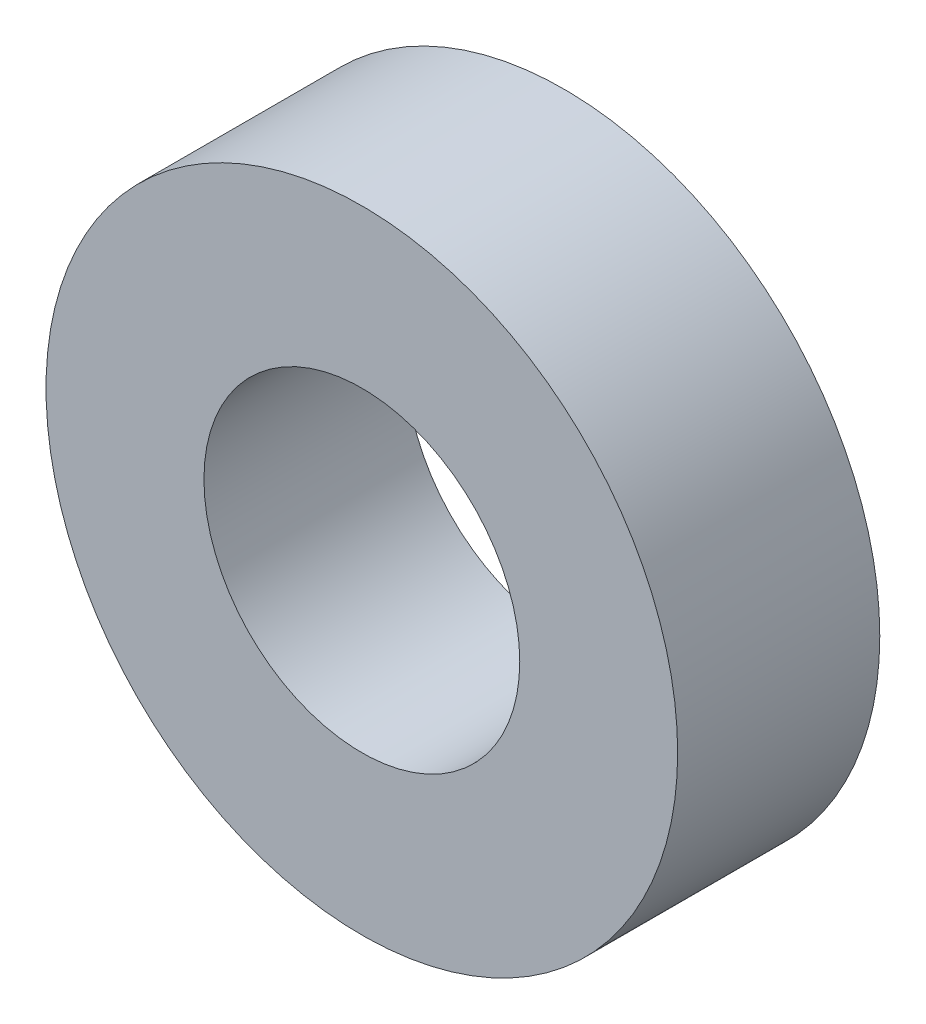
ISO-10303-21;
HEADER;
FILE_DESCRIPTION(('STEP AP214'),'2;1');
FILE_NAME('part.step','',(''),(''),'','','');
FILE_SCHEMA(('AUTOMOTIVE_DESIGN { 1 0 10303 214 1 1 1 1 }'));
ENDSEC;
DATA;
#1=APPLICATION_CONTEXT('core data for automotive mechanical design processes');
#2=APPLICATION_PROTOCOL_DEFINITION('international standard','automotive_design',2000,#1);
#3=PRODUCT_CONTEXT('',#1,'mechanical');
#4=PRODUCT('Part','Part','',(#3));
#5=PRODUCT_RELATED_PRODUCT_CATEGORY('part','',(#4));
#6=PRODUCT_DEFINITION_FORMATION('','',#4);
#7=PRODUCT_DEFINITION_CONTEXT('part definition',#1,'design');
#8=PRODUCT_DEFINITION('design','',#6,#7);
#9=PRODUCT_DEFINITION_SHAPE('','',#8);
#10=(LENGTH_UNIT() NAMED_UNIT(*) SI_UNIT(.MILLI.,.METRE.));
#11=(NAMED_UNIT(*) PLANE_ANGLE_UNIT() SI_UNIT($,.RADIAN.));
#12=(NAMED_UNIT(*) SI_UNIT($,.STERADIAN.) SOLID_ANGLE_UNIT());
#13=UNCERTAINTY_MEASURE_WITH_UNIT(LENGTH_MEASURE(1.E-05),#10,'distance_accuracy_value','');
#14=(GEOMETRIC_REPRESENTATION_CONTEXT(3) GLOBAL_UNCERTAINTY_ASSIGNED_CONTEXT((#13)) GLOBAL_UNIT_ASSIGNED_CONTEXT((#10,
#11,#12)) REPRESENTATION_CONTEXT('',''));
#15=CARTESIAN_POINT('',(0.,0.,0.));
#16=DIRECTION('',(0.,0.,1.));
#17=DIRECTION('',(1.,0.,0.));
#18=AXIS2_PLACEMENT_3D('',#15,#16,#17);
#19=CARTESIAN_POINT('',(0.,0.,16.));
#20=DIRECTION('',(0.,0.,1.));
#21=DIRECTION('',(1.,0.,0.));
#22=AXIS2_PLACEMENT_3D('',#19,#20,#21);
#23=PLANE('',#22);
#24=CARTESIAN_POINT('',(0.,0.,16.));
#25=DIRECTION('',(0.,0.,1.));
#26=DIRECTION('',(1.,0.,0.));
#27=AXIS2_PLACEMENT_3D('',#24,#25,#26);
#28=CIRCLE('',#27,25.);
#29=CARTESIAN_POINT('',(25.,0.,16.));
#30=VERTEX_POINT('',#29);
#31=EDGE_CURVE('E10',#30,#30,#28,.T.);
#32=ORIENTED_EDGE('',*,*,#31,.T.);
#33=EDGE_LOOP('',(#32));
#34=FACE_BOUND('',#33,.T.);
#35=CARTESIAN_POINT('',(0.,0.,16.));
#36=DIRECTION('',(0.,0.,1.));
#37=DIRECTION('',(1.,0.,0.));
#38=AXIS2_PLACEMENT_3D('',#35,#36,#37);
#39=CIRCLE('',#38,12.5);
#40=CARTESIAN_POINT('',(12.5,0.,16.));
#41=VERTEX_POINT('',#40);
#42=EDGE_CURVE('E50',#41,#41,#39,.T.);
#43=ORIENTED_EDGE('',*,*,#42,.F.);
#44=EDGE_LOOP('',(#43));
#45=FACE_BOUND('',#44,.T.);
#46=ADVANCED_FACE('F39',(#34,#45),#23,.T.);
#47=CARTESIAN_POINT('',(0.,0.,0.));
#48=DIRECTION('',(0.,0.,1.));
#49=DIRECTION('',(1.,0.,0.));
#50=AXIS2_PLACEMENT_3D('',#47,#48,#49);
#51=PLANE('',#50);
#52=CARTESIAN_POINT('',(0.,0.,0.));
#53=DIRECTION('',(0.,0.,1.));
#54=DIRECTION('',(1.,0.,0.));
#55=AXIS2_PLACEMENT_3D('',#52,#53,#54);
#56=CIRCLE('',#55,25.);
#57=CARTESIAN_POINT('',(25.,0.,0.));
#58=VERTEX_POINT('',#57);
#59=EDGE_CURVE('E43',#58,#58,#56,.T.);
#60=ORIENTED_EDGE('',*,*,#59,.F.);
#61=EDGE_LOOP('',(#60));
#62=FACE_BOUND('',#61,.T.);
#63=CARTESIAN_POINT('',(0.,0.,0.));
#64=DIRECTION('',(0.,0.,1.));
#65=DIRECTION('',(1.,0.,0.));
#66=AXIS2_PLACEMENT_3D('',#63,#64,#65);
#67=CIRCLE('',#66,12.5);
#68=CARTESIAN_POINT('',(12.5,0.,0.));
#69=VERTEX_POINT('',#68);
#70=EDGE_CURVE('E52',#69,#69,#67,.T.);
#71=ORIENTED_EDGE('',*,*,#70,.T.);
#72=EDGE_LOOP('',(#71));
#73=FACE_BOUND('',#72,.T.);
#74=ADVANCED_FACE('F62',(#62,#73),#51,.F.);
#75=CARTESIAN_POINT('',(0.,0.,16.));
#76=DIRECTION('',(0.,0.,-1.));
#77=DIRECTION('',(-1.,0.,0.));
#78=AXIS2_PLACEMENT_3D('',#75,#76,#77);
#79=CYLINDRICAL_SURFACE('',#78,25.);
#80=ORIENTED_EDGE('',*,*,#31,.F.);
#81=EDGE_LOOP('',(#80));
#82=FACE_BOUND('',#81,.T.);
#83=ORIENTED_EDGE('',*,*,#59,.T.);
#84=EDGE_LOOP('',(#83));
#85=FACE_BOUND('',#84,.T.);
#86=ADVANCED_FACE('F41',(#82,#85),#79,.T.);
#87=CARTESIAN_POINT('',(0.,0.,16.));
#88=DIRECTION('',(0.,0.,-1.));
#89=DIRECTION('',(-1.,0.,0.));
#90=AXIS2_PLACEMENT_3D('',#87,#88,#89);
#91=CYLINDRICAL_SURFACE('',#90,12.5);
#92=ORIENTED_EDGE('',*,*,#42,.T.);
#93=EDGE_LOOP('',(#92));
#94=FACE_BOUND('',#93,.T.);
#95=ORIENTED_EDGE('',*,*,#70,.F.);
#96=EDGE_LOOP('',(#95));
#97=FACE_BOUND('',#96,.T.);
#98=ADVANCED_FACE('F58',(#94,#97),#91,.F.);
#99=CLOSED_SHELL('',(#46,#74,#86,#98));
#100=MANIFOLD_SOLID_BREP('B2',#99);
#101=ADVANCED_BREP_SHAPE_REPRESENTATION('',(#18,#100),#14);
#102=SHAPE_DEFINITION_REPRESENTATION(#9,#101);
ENDSEC;
END-ISO-10303-21;
